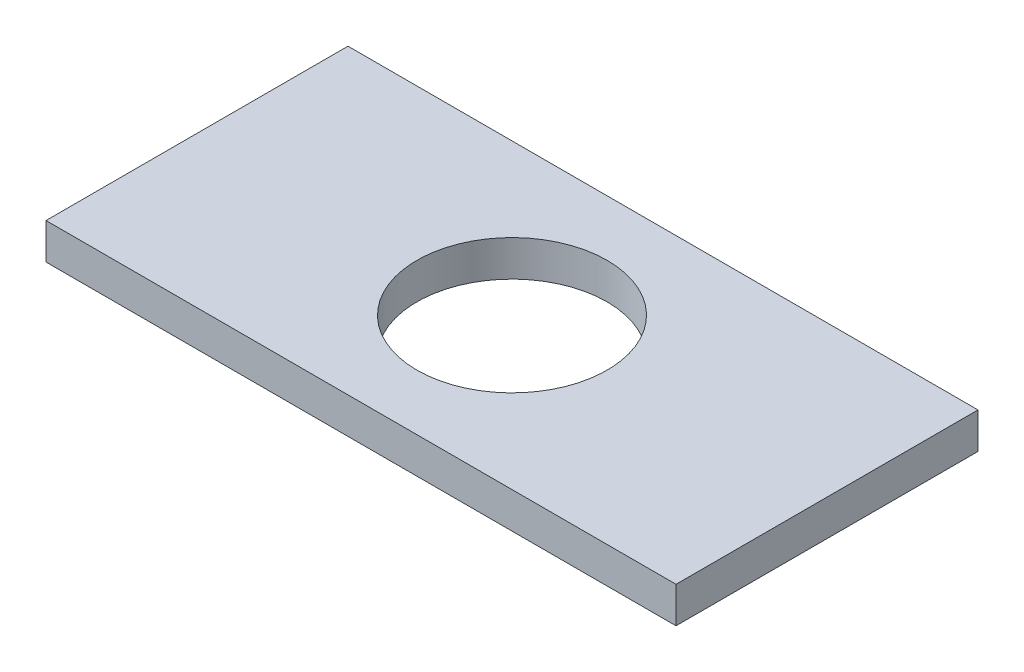
ISO-10303-21;
HEADER;
FILE_DESCRIPTION(('STEP AP214'),'2;1');
FILE_NAME('part.step','',(''),(''),'','','');
FILE_SCHEMA(('AUTOMOTIVE_DESIGN { 1 0 10303 214 1 1 1 1 }'));
ENDSEC;
DATA;
#1=APPLICATION_CONTEXT('core data for automotive mechanical design processes');
#2=APPLICATION_PROTOCOL_DEFINITION('international standard','automotive_design',2000,#1);
#3=PRODUCT_CONTEXT('',#1,'mechanical');
#4=PRODUCT('Part','Part','',(#3));
#5=PRODUCT_RELATED_PRODUCT_CATEGORY('part','',(#4));
#6=PRODUCT_DEFINITION_FORMATION('','',#4);
#7=PRODUCT_DEFINITION_CONTEXT('part definition',#1,'design');
#8=PRODUCT_DEFINITION('design','',#6,#7);
#9=PRODUCT_DEFINITION_SHAPE('','',#8);
#10=(LENGTH_UNIT() NAMED_UNIT(*) SI_UNIT(.MILLI.,.METRE.));
#11=(NAMED_UNIT(*) PLANE_ANGLE_UNIT() SI_UNIT($,.RADIAN.));
#12=(NAMED_UNIT(*) SI_UNIT($,.STERADIAN.) SOLID_ANGLE_UNIT());
#13=UNCERTAINTY_MEASURE_WITH_UNIT(LENGTH_MEASURE(1.E-05),#10,'distance_accuracy_value','');
#14=(GEOMETRIC_REPRESENTATION_CONTEXT(3) GLOBAL_UNCERTAINTY_ASSIGNED_CONTEXT((#13)) GLOBAL_UNIT_ASSIGNED_CONTEXT((#10,
#11,#12)) REPRESENTATION_CONTEXT('',''));
#15=CARTESIAN_POINT('',(0.,0.,0.));
#16=DIRECTION('',(0.,0.,1.));
#17=DIRECTION('',(1.,0.,0.));
#18=AXIS2_PLACEMENT_3D('',#15,#16,#17);
#19=CARTESIAN_POINT('',(0.,10.,0.));
#20=DIRECTION('',(0.,1.,0.));
#21=DIRECTION('',(0.,0.,1.));
#22=AXIS2_PLACEMENT_3D('',#19,#20,#21);
#23=PLANE('',#22);
#24=DIRECTION('',(0.,0.,-1.));
#25=VECTOR('',#24,1.);
#26=CARTESIAN_POINT('',(87.5398848281034,10.,-41.9587723831254));
#27=LINE('',#26,#25);
#28=CARTESIAN_POINT('',(87.5398848281034,10.,41.9587723831254));
#29=VERTEX_POINT('',#28);
#30=CARTESIAN_POINT('',(87.5398848281034,10.,-41.9587723831254));
#31=VERTEX_POINT('',#30);
#32=EDGE_CURVE('E92',#29,#31,#27,.T.);
#33=ORIENTED_EDGE('',*,*,#32,.T.);
#34=DIRECTION('',(-1.,0.,0.));
#35=VECTOR('',#34,1.);
#36=CARTESIAN_POINT('',(-87.5398848281034,10.,-41.9587723831254));
#37=LINE('',#36,#35);
#38=CARTESIAN_POINT('',(-87.5398848281034,10.,-41.9587723831254));
#39=VERTEX_POINT('',#38);
#40=EDGE_CURVE('E87',#31,#39,#37,.T.);
#41=ORIENTED_EDGE('',*,*,#40,.T.);
#42=DIRECTION('',(0.,0.,1.));
#43=VECTOR('',#42,1.);
#44=CARTESIAN_POINT('',(-87.5398848281034,10.,-41.9587723831254));
#45=LINE('',#44,#43);
#46=CARTESIAN_POINT('',(-87.5398848281034,10.,41.9587723831254));
#47=VERTEX_POINT('',#46);
#48=EDGE_CURVE('E90',#39,#47,#45,.T.);
#49=ORIENTED_EDGE('',*,*,#48,.T.);
#50=DIRECTION('',(1.,0.,0.));
#51=VECTOR('',#50,1.);
#52=CARTESIAN_POINT('',(-87.5398848281034,10.,41.9587723831254));
#53=LINE('',#52,#51);
#54=EDGE_CURVE('E57',#47,#29,#53,.T.);
#55=ORIENTED_EDGE('',*,*,#54,.T.);
#56=EDGE_LOOP('',(#33,#41,#49,#55));
#57=FACE_BOUND('',#56,.T.);
#58=CARTESIAN_POINT('',(0.,10.,0.));
#59=DIRECTION('',(0.,1.,0.));
#60=DIRECTION('',(0.,0.,1.));
#61=AXIS2_PLACEMENT_3D('',#58,#59,#60);
#62=CIRCLE('',#61,26.4341139083545);
#63=CARTESIAN_POINT('',(0.,10.,26.4341139083545));
#64=VERTEX_POINT('',#63);
#65=EDGE_CURVE('E112',#64,#64,#62,.T.);
#66=ORIENTED_EDGE('',*,*,#65,.F.);
#67=EDGE_LOOP('',(#66));
#68=FACE_BOUND('',#67,.T.);
#69=ADVANCED_FACE('F39',(#57,#68),#23,.T.);
#70=CARTESIAN_POINT('',(0.,0.,0.));
#71=DIRECTION('',(0.,1.,0.));
#72=DIRECTION('',(0.,0.,1.));
#73=AXIS2_PLACEMENT_3D('',#70,#71,#72);
#74=PLANE('',#73);
#75=DIRECTION('',(0.,0.,-1.));
#76=VECTOR('',#75,1.);
#77=CARTESIAN_POINT('',(87.5398848281034,0.,-41.9587723831254));
#78=LINE('',#77,#76);
#79=CARTESIAN_POINT('',(87.5398848281034,0.,41.9587723831254));
#80=VERTEX_POINT('',#79);
#81=CARTESIAN_POINT('',(87.5398848281034,0.,-41.9587723831254));
#82=VERTEX_POINT('',#81);
#83=EDGE_CURVE('E108',#80,#82,#78,.T.);
#84=ORIENTED_EDGE('',*,*,#83,.F.);
#85=DIRECTION('',(1.,0.,0.));
#86=VECTOR('',#85,1.);
#87=CARTESIAN_POINT('',(-87.5398848281034,0.,41.9587723831254));
#88=LINE('',#87,#86);
#89=CARTESIAN_POINT('',(-87.5398848281034,0.,41.9587723831254));
#90=VERTEX_POINT('',#89);
#91=EDGE_CURVE('E80',#90,#80,#88,.T.);
#92=ORIENTED_EDGE('',*,*,#91,.F.);
#93=DIRECTION('',(0.,0.,1.));
#94=VECTOR('',#93,1.);
#95=CARTESIAN_POINT('',(-87.5398848281034,0.,-41.9587723831254));
#96=LINE('',#95,#94);
#97=CARTESIAN_POINT('',(-87.5398848281034,0.,-41.9587723831254));
#98=VERTEX_POINT('',#97);
#99=EDGE_CURVE('E74',#98,#90,#96,.T.);
#100=ORIENTED_EDGE('',*,*,#99,.F.);
#101=DIRECTION('',(-1.,0.,0.));
#102=VECTOR('',#101,1.);
#103=CARTESIAN_POINT('',(-87.5398848281034,0.,-41.9587723831254));
#104=LINE('',#103,#102);
#105=EDGE_CURVE('E97',#82,#98,#104,.T.);
#106=ORIENTED_EDGE('',*,*,#105,.F.);
#107=EDGE_LOOP('',(#84,#92,#100,#106));
#108=FACE_BOUND('',#107,.T.);
#109=CARTESIAN_POINT('',(0.,0.,0.));
#110=DIRECTION('',(0.,1.,0.));
#111=DIRECTION('',(0.,0.,1.));
#112=AXIS2_PLACEMENT_3D('',#109,#110,#111);
#113=CIRCLE('',#112,26.4341139083545);
#114=CARTESIAN_POINT('',(0.,0.,26.4341139083545));
#115=VERTEX_POINT('',#114);
#116=EDGE_CURVE('E130',#115,#115,#113,.T.);
#117=ORIENTED_EDGE('',*,*,#116,.T.);
#118=EDGE_LOOP('',(#117));
#119=FACE_BOUND('',#118,.T.);
#120=ADVANCED_FACE('F125',(#108,#119),#74,.F.);
#121=CARTESIAN_POINT('',(87.5398848281034,10.,-41.9587723831254));
#122=DIRECTION('',(-1.,0.,0.));
#123=DIRECTION('',(0.,0.,1.));
#124=AXIS2_PLACEMENT_3D('',#121,#122,#123);
#125=PLANE('',#124);
#126=ORIENTED_EDGE('',*,*,#83,.T.);
#127=DIRECTION('',(0.,-1.,0.));
#128=VECTOR('',#127,1.);
#129=CARTESIAN_POINT('',(87.5398848281034,10.,-41.9587723831254));
#130=LINE('',#129,#128);
#131=EDGE_CURVE('E11',#31,#82,#130,.T.);
#132=ORIENTED_EDGE('',*,*,#131,.F.);
#133=ORIENTED_EDGE('',*,*,#32,.F.);
#134=DIRECTION('',(0.,-1.,0.));
#135=VECTOR('',#134,1.);
#136=CARTESIAN_POINT('',(87.5398848281034,10.,41.9587723831254));
#137=LINE('',#136,#135);
#138=EDGE_CURVE('E104',#29,#80,#137,.T.);
#139=ORIENTED_EDGE('',*,*,#138,.T.);
#140=EDGE_LOOP('',(#126,#132,#133,#139));
#141=FACE_BOUND('',#140,.T.);
#142=ADVANCED_FACE('F41',(#141),#125,.F.);
#143=CARTESIAN_POINT('',(-87.5398848281034,10.,-41.9587723831254));
#144=DIRECTION('',(0.,0.,1.));
#145=DIRECTION('',(1.,0.,0.));
#146=AXIS2_PLACEMENT_3D('',#143,#144,#145);
#147=PLANE('',#146);
#148=ORIENTED_EDGE('',*,*,#105,.T.);
#149=DIRECTION('',(0.,-1.,0.));
#150=VECTOR('',#149,1.);
#151=CARTESIAN_POINT('',(-87.5398848281034,10.,-41.9587723831254));
#152=LINE('',#151,#150);
#153=EDGE_CURVE('E49',#39,#98,#152,.T.);
#154=ORIENTED_EDGE('',*,*,#153,.F.);
#155=ORIENTED_EDGE('',*,*,#40,.F.);
#156=ORIENTED_EDGE('',*,*,#131,.T.);
#157=EDGE_LOOP('',(#148,#154,#155,#156));
#158=FACE_BOUND('',#157,.T.);
#159=ADVANCED_FACE('F96',(#158),#147,.F.);
#160=CARTESIAN_POINT('',(-87.5398848281034,10.,-41.9587723831254));
#161=DIRECTION('',(1.,0.,0.));
#162=DIRECTION('',(0.,0.,-1.));
#163=AXIS2_PLACEMENT_3D('',#160,#161,#162);
#164=PLANE('',#163);
#165=ORIENTED_EDGE('',*,*,#99,.T.);
#166=DIRECTION('',(0.,-1.,0.));
#167=VECTOR('',#166,1.);
#168=CARTESIAN_POINT('',(-87.5398848281034,10.,41.9587723831254));
#169=LINE('',#168,#167);
#170=EDGE_CURVE('E99',#47,#90,#169,.T.);
#171=ORIENTED_EDGE('',*,*,#170,.F.);
#172=ORIENTED_EDGE('',*,*,#48,.F.);
#173=ORIENTED_EDGE('',*,*,#153,.T.);
#174=EDGE_LOOP('',(#165,#171,#172,#173));
#175=FACE_BOUND('',#174,.T.);
#176=ADVANCED_FACE('F100',(#175),#164,.F.);
#177=CARTESIAN_POINT('',(-87.5398848281034,10.,41.9587723831254));
#178=DIRECTION('',(0.,0.,-1.));
#179=DIRECTION('',(-1.,0.,0.));
#180=AXIS2_PLACEMENT_3D('',#177,#178,#179);
#181=PLANE('',#180);
#182=ORIENTED_EDGE('',*,*,#91,.T.);
#183=ORIENTED_EDGE('',*,*,#138,.F.);
#184=ORIENTED_EDGE('',*,*,#54,.F.);
#185=ORIENTED_EDGE('',*,*,#170,.T.);
#186=EDGE_LOOP('',(#182,#183,#184,#185));
#187=FACE_BOUND('',#186,.T.);
#188=ADVANCED_FACE('F122',(#187),#181,.F.);
#189=CARTESIAN_POINT('',(0.,10.,0.));
#190=DIRECTION('',(0.,-1.,0.));
#191=DIRECTION('',(0.,0.,-1.));
#192=AXIS2_PLACEMENT_3D('',#189,#190,#191);
#193=CYLINDRICAL_SURFACE('',#192,26.4341139083545);
#194=ORIENTED_EDGE('',*,*,#65,.T.);
#195=EDGE_LOOP('',(#194));
#196=FACE_BOUND('',#195,.T.);
#197=ORIENTED_EDGE('',*,*,#116,.F.);
#198=EDGE_LOOP('',(#197));
#199=FACE_BOUND('',#198,.T.);
#200=ADVANCED_FACE('F138',(#196,#199),#193,.F.);
#201=CLOSED_SHELL('',(#69,#120,#142,#159,#176,#188,#200));
#202=MANIFOLD_SOLID_BREP('B2',#201);
#203=ADVANCED_BREP_SHAPE_REPRESENTATION('',(#18,#202),#14);
#204=SHAPE_DEFINITION_REPRESENTATION(#9,#203);
ENDSEC;
END-ISO-10303-21;
